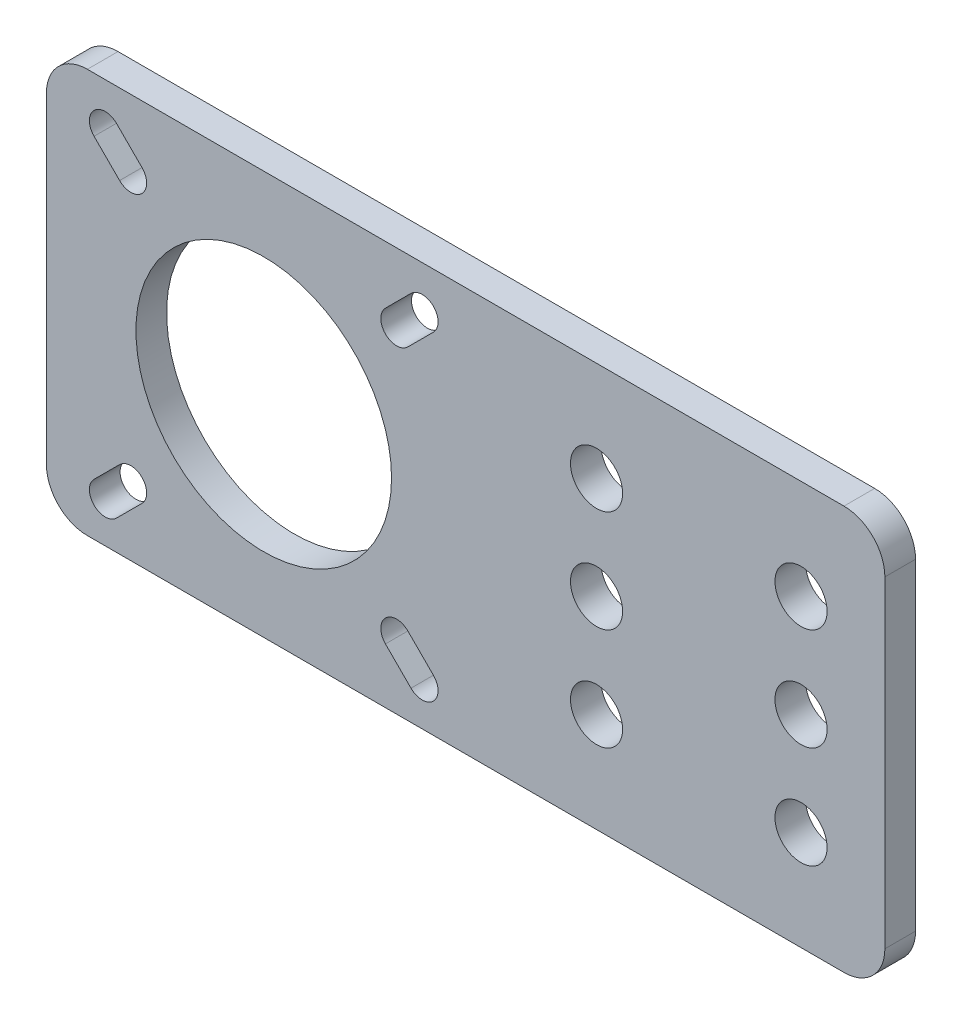
ISO-10303-21;
HEADER;
FILE_DESCRIPTION(('STEP AP214'),'2;1');
FILE_NAME('part.step','',(''),(''),'','','');
FILE_SCHEMA(('AUTOMOTIVE_DESIGN { 1 0 10303 214 1 1 1 1 }'));
ENDSEC;
DATA;
#1=APPLICATION_CONTEXT('core data for automotive mechanical design processes');
#2=APPLICATION_PROTOCOL_DEFINITION('international standard','automotive_design',2000,#1);
#3=PRODUCT_CONTEXT('',#1,'mechanical');
#4=PRODUCT('Part','Part','',(#3));
#5=PRODUCT_RELATED_PRODUCT_CATEGORY('part','',(#4));
#6=PRODUCT_DEFINITION_FORMATION('','',#4);
#7=PRODUCT_DEFINITION_CONTEXT('part definition',#1,'design');
#8=PRODUCT_DEFINITION('design','',#6,#7);
#9=PRODUCT_DEFINITION_SHAPE('','',#8);
#10=(LENGTH_UNIT() NAMED_UNIT(*) SI_UNIT(.MILLI.,.METRE.));
#11=(NAMED_UNIT(*) PLANE_ANGLE_UNIT() SI_UNIT($,.RADIAN.));
#12=(NAMED_UNIT(*) SI_UNIT($,.STERADIAN.) SOLID_ANGLE_UNIT());
#13=UNCERTAINTY_MEASURE_WITH_UNIT(LENGTH_MEASURE(1.E-05),#10,'distance_accuracy_value','');
#14=(GEOMETRIC_REPRESENTATION_CONTEXT(3) GLOBAL_UNCERTAINTY_ASSIGNED_CONTEXT((#13)) GLOBAL_UNIT_ASSIGNED_CONTEXT((#10,
#11,#12)) REPRESENTATION_CONTEXT('',''));
#15=CARTESIAN_POINT('',(0.,0.,0.));
#16=DIRECTION('',(0.,0.,1.));
#17=DIRECTION('',(1.,0.,0.));
#18=AXIS2_PLACEMENT_3D('',#15,#16,#17);
#19=CARTESIAN_POINT('',(37.9262866139666,47.8327926657264,3.));
#20=DIRECTION('',(0.,0.,1.));
#21=DIRECTION('',(1.,0.,0.));
#22=AXIS2_PLACEMENT_3D('',#19,#20,#21);
#23=PLANE('',#22);
#24=CARTESIAN_POINT('',(13.7262866139666,42.0827926657264,3.));
#25=DIRECTION('',(0.,0.,1.));
#26=DIRECTION('',(1.,0.,0.));
#27=AXIS2_PLACEMENT_3D('',#24,#25,#26);
#28=CIRCLE('',#27,2.54999999999999);
#29=CARTESIAN_POINT('',(16.2762866139666,42.0827926657264,3.));
#30=VERTEX_POINT('',#29);
#31=EDGE_CURVE('E328',#30,#30,#28,.T.);
#32=ORIENTED_EDGE('',*,*,#31,.F.);
#33=EDGE_LOOP('',(#32));
#34=FACE_BOUND('',#33,.T.);
#35=CARTESIAN_POINT('',(33.7262866139666,32.0827926657264,3.));
#36=DIRECTION('',(0.,0.,1.));
#37=DIRECTION('',(1.,0.,0.));
#38=AXIS2_PLACEMENT_3D('',#35,#36,#37);
#39=CIRCLE('',#38,2.54999999999999);
#40=CARTESIAN_POINT('',(36.2762866139666,32.0827926657264,3.));
#41=VERTEX_POINT('',#40);
#42=EDGE_CURVE('E340',#41,#41,#39,.T.);
#43=ORIENTED_EDGE('',*,*,#42,.F.);
#44=EDGE_LOOP('',(#43));
#45=FACE_BOUND('',#44,.T.);
#46=CARTESIAN_POINT('',(33.7262866139666,22.0827926657264,3.));
#47=DIRECTION('',(0.,0.,1.));
#48=DIRECTION('',(1.,0.,0.));
#49=AXIS2_PLACEMENT_3D('',#46,#47,#48);
#50=CIRCLE('',#49,2.54999999999999);
#51=CARTESIAN_POINT('',(36.2762866139666,22.0827926657264,3.));
#52=VERTEX_POINT('',#51);
#53=EDGE_CURVE('E352',#52,#52,#50,.T.);
#54=ORIENTED_EDGE('',*,*,#53,.F.);
#55=EDGE_LOOP('',(#54));
#56=FACE_BOUND('',#55,.T.);
#57=CARTESIAN_POINT('',(37.9262866139666,47.8327926657264,3.));
#58=DIRECTION('',(0.,0.,1.));
#59=DIRECTION('',(1.,0.,0.));
#60=AXIS2_PLACEMENT_3D('',#57,#58,#59);
#61=CIRCLE('',#60,4.);
#62=CARTESIAN_POINT('',(41.9262866139666,47.8327926657264,3.));
#63=VERTEX_POINT('',#62);
#64=CARTESIAN_POINT('',(37.9262866139666,51.8327926657264,3.));
#65=VERTEX_POINT('',#64);
#66=EDGE_CURVE('E364',#63,#65,#61,.T.);
#67=ORIENTED_EDGE('',*,*,#66,.T.);
#68=DIRECTION('',(-1.,0.,0.));
#69=VECTOR('',#68,1.);
#70=CARTESIAN_POINT('',(-36.0737133860334,51.8327926657264,3.));
#71=LINE('',#70,#69);
#72=CARTESIAN_POINT('',(-36.0737133860334,51.8327926657264,3.));
#73=VERTEX_POINT('',#72);
#74=EDGE_CURVE('E367',#65,#73,#71,.T.);
#75=ORIENTED_EDGE('',*,*,#74,.T.);
#76=CARTESIAN_POINT('',(-36.0737133860334,47.8327926657264,3.));
#77=DIRECTION('',(0.,0.,1.));
#78=DIRECTION('',(-1.,0.,0.));
#79=AXIS2_PLACEMENT_3D('',#76,#77,#78);
#80=CIRCLE('',#79,4.);
#81=CARTESIAN_POINT('',(-40.0737133860334,47.8327926657264,3.));
#82=VERTEX_POINT('',#81);
#83=EDGE_CURVE('E370',#73,#82,#80,.T.);
#84=ORIENTED_EDGE('',*,*,#83,.T.);
#85=DIRECTION('',(0.,-1.,0.));
#86=VECTOR('',#85,1.);
#87=CARTESIAN_POINT('',(-40.0737133860334,47.8327926657264,3.));
#88=LINE('',#87,#86);
#89=CARTESIAN_POINT('',(-40.0737133860334,16.3327926657264,3.));
#90=VERTEX_POINT('',#89);
#91=EDGE_CURVE('E372',#82,#90,#88,.T.);
#92=ORIENTED_EDGE('',*,*,#91,.T.);
#93=CARTESIAN_POINT('',(-36.0737133860334,16.3327926657264,3.));
#94=DIRECTION('',(0.,0.,1.));
#95=DIRECTION('',(1.,0.,0.));
#96=AXIS2_PLACEMENT_3D('',#93,#94,#95);
#97=CIRCLE('',#96,4.);
#98=CARTESIAN_POINT('',(-36.0737133860334,12.3327926657264,3.));
#99=VERTEX_POINT('',#98);
#100=EDGE_CURVE('E374',#90,#99,#97,.T.);
#101=ORIENTED_EDGE('',*,*,#100,.T.);
#102=DIRECTION('',(1.,0.,0.));
#103=VECTOR('',#102,1.);
#104=CARTESIAN_POINT('',(-36.0737133860334,12.3327926657264,3.));
#105=LINE('',#104,#103);
#106=CARTESIAN_POINT('',(37.9262866139666,12.3327926657264,3.));
#107=VERTEX_POINT('',#106);
#108=EDGE_CURVE('E376',#99,#107,#105,.T.);
#109=ORIENTED_EDGE('',*,*,#108,.T.);
#110=CARTESIAN_POINT('',(37.9262866139666,16.3327926657264,3.));
#111=DIRECTION('',(0.,0.,1.));
#112=DIRECTION('',(1.,0.,0.));
#113=AXIS2_PLACEMENT_3D('',#110,#111,#112);
#114=CIRCLE('',#113,4.);
#115=CARTESIAN_POINT('',(41.9262866139666,16.3327926657264,3.));
#116=VERTEX_POINT('',#115);
#117=EDGE_CURVE('E378',#107,#116,#114,.T.);
#118=ORIENTED_EDGE('',*,*,#117,.T.);
#119=DIRECTION('',(0.,1.,0.));
#120=VECTOR('',#119,1.);
#121=CARTESIAN_POINT('',(41.9262866139666,47.8327926657264,3.));
#122=LINE('',#121,#120);
#123=EDGE_CURVE('E380',#116,#63,#122,.T.);
#124=ORIENTED_EDGE('',*,*,#123,.T.);
#125=EDGE_LOOP('',(#67,#75,#84,#92,#101,#109,#118,#124));
#126=FACE_BOUND('',#125,.T.);
#127=CARTESIAN_POINT('',(-18.8237133860334,32.0827926657264,3.));
#128=DIRECTION('',(0.,0.,1.));
#129=DIRECTION('',(1.,0.,0.));
#130=AXIS2_PLACEMENT_3D('',#127,#128,#129);
#131=CIRCLE('',#130,12.5);
#132=CARTESIAN_POINT('',(-6.32371338603339,32.0827926657264,3.));
#133=VERTEX_POINT('',#132);
#134=EDGE_CURVE('E358',#133,#133,#131,.T.);
#135=ORIENTED_EDGE('',*,*,#134,.F.);
#136=EDGE_LOOP('',(#135));
#137=FACE_BOUND('',#136,.T.);
#138=CARTESIAN_POINT('',(33.7262866139666,42.0827926657264,3.));
#139=DIRECTION('',(0.,0.,1.));
#140=DIRECTION('',(1.,0.,0.));
#141=AXIS2_PLACEMENT_3D('',#138,#139,#140);
#142=CIRCLE('',#141,2.54999999999999);
#143=CARTESIAN_POINT('',(36.2762866139666,42.0827926657264,3.));
#144=VERTEX_POINT('',#143);
#145=EDGE_CURVE('E346',#144,#144,#142,.T.);
#146=ORIENTED_EDGE('',*,*,#145,.F.);
#147=EDGE_LOOP('',(#146));
#148=FACE_BOUND('',#147,.T.);
#149=CARTESIAN_POINT('',(13.7262866139666,22.0827926657264,3.));
#150=DIRECTION('',(0.,0.,1.));
#151=DIRECTION('',(1.,0.,0.));
#152=AXIS2_PLACEMENT_3D('',#149,#150,#151);
#153=CIRCLE('',#152,2.54999999999999);
#154=CARTESIAN_POINT('',(16.2762866139666,22.0827926657264,3.));
#155=VERTEX_POINT('',#154);
#156=EDGE_CURVE('E334',#155,#155,#153,.T.);
#157=ORIENTED_EDGE('',*,*,#156,.F.);
#158=EDGE_LOOP('',(#157));
#159=FACE_BOUND('',#158,.T.);
#160=CARTESIAN_POINT('',(13.7262866139666,32.0827926657264,3.));
#161=DIRECTION('',(0.,0.,1.));
#162=DIRECTION('',(1.,0.,0.));
#163=AXIS2_PLACEMENT_3D('',#160,#161,#162);
#164=CIRCLE('',#163,2.54999999999999);
#165=CARTESIAN_POINT('',(16.2762866139666,32.0827926657264,3.));
#166=VERTEX_POINT('',#165);
#167=EDGE_CURVE('E322',#166,#166,#164,.T.);
#168=ORIENTED_EDGE('',*,*,#167,.F.);
#169=EDGE_LOOP('',(#168));
#170=FACE_BOUND('',#169,.T.);
#171=DIRECTION('',(0.70710678118654,0.707106781186555,0.));
#172=VECTOR('',#171,1.);
#173=CARTESIAN_POINT('',(-33.2276978751942,15.2367771548873,3.));
#174=LINE('',#173,#172);
#175=CARTESIAN_POINT('',(-33.2276978751942,15.2367771548873,3.));
#176=VERTEX_POINT('',#175);
#177=CARTESIAN_POINT('',(-30.7276978751942,17.7367771548873,3.));
#178=VERTEX_POINT('',#177);
#179=EDGE_CURVE('E293',#176,#178,#174,.T.);
#180=ORIENTED_EDGE('',*,*,#179,.F.);
#181=CARTESIAN_POINT('',(-34.3237133860334,16.3327926657264,3.));
#182=DIRECTION('',(0.,0.,1.));
#183=DIRECTION('',(1.,0.,0.));
#184=AXIS2_PLACEMENT_3D('',#181,#182,#183);
#185=CIRCLE('',#184,1.54999999999999);
#186=CARTESIAN_POINT('',(-35.4197288968725,17.4288081765655,3.));
#187=VERTEX_POINT('',#186);
#188=EDGE_CURVE('E291',#187,#176,#185,.T.);
#189=ORIENTED_EDGE('',*,*,#188,.F.);
#190=DIRECTION('',(-0.707106781186544,-0.70710678118655,0.));
#191=VECTOR('',#190,1.);
#192=CARTESIAN_POINT('',(-35.4197288968725,17.4288081765655,3.));
#193=LINE('',#192,#191);
#194=CARTESIAN_POINT('',(-32.9197288968725,19.9288081765655,3.));
#195=VERTEX_POINT('',#194);
#196=EDGE_CURVE('E299',#195,#187,#193,.T.);
#197=ORIENTED_EDGE('',*,*,#196,.F.);
#198=CARTESIAN_POINT('',(-31.8237133860334,18.8327926657264,3.));
#199=DIRECTION('',(0.,0.,1.));
#200=DIRECTION('',(1.,0.,0.));
#201=AXIS2_PLACEMENT_3D('',#198,#199,#200);
#202=CIRCLE('',#201,1.54999999999998);
#203=EDGE_CURVE('E296',#178,#195,#202,.T.);
#204=ORIENTED_EDGE('',*,*,#203,.F.);
#205=EDGE_LOOP('',(#180,#189,#197,#204));
#206=FACE_BOUND('',#205,.T.);
#207=DIRECTION('',(0.707106781186543,-0.707106781186551,0.));
#208=VECTOR('',#207,1.);
#209=CARTESIAN_POINT('',(-4.41972889687255,15.2367771548872,3.));
#210=LINE('',#209,#208);
#211=CARTESIAN_POINT('',(-6.91972889687255,17.7367771548873,3.));
#212=VERTEX_POINT('',#211);
#213=CARTESIAN_POINT('',(-4.41972889687255,15.2367771548872,3.));
#214=VERTEX_POINT('',#213);
#215=EDGE_CURVE('E262',#212,#214,#210,.T.);
#216=ORIENTED_EDGE('',*,*,#215,.F.);
#217=CARTESIAN_POINT('',(-5.82371338603339,18.8327926657264,3.));
#218=DIRECTION('',(0.,0.,1.));
#219=DIRECTION('',(-1.,0.,0.));
#220=AXIS2_PLACEMENT_3D('',#217,#218,#219);
#221=CIRCLE('',#220,1.55);
#222=CARTESIAN_POINT('',(-4.72769787519425,19.9288081765656,3.));
#223=VERTEX_POINT('',#222);
#224=EDGE_CURVE('E260',#223,#212,#221,.T.);
#225=ORIENTED_EDGE('',*,*,#224,.F.);
#226=DIRECTION('',(-0.707106781186544,0.70710678118655,0.));
#227=VECTOR('',#226,1.);
#228=CARTESIAN_POINT('',(-2.22769787519424,17.4288081765655,3.));
#229=LINE('',#228,#227);
#230=CARTESIAN_POINT('',(-2.22769787519424,17.4288081765655,3.));
#231=VERTEX_POINT('',#230);
#232=EDGE_CURVE('E268',#231,#223,#229,.T.);
#233=ORIENTED_EDGE('',*,*,#232,.F.);
#234=CARTESIAN_POINT('',(-3.32371338603339,16.3327926657264,3.));
#235=DIRECTION('',(0.,0.,1.));
#236=DIRECTION('',(-1.,0.,0.));
#237=AXIS2_PLACEMENT_3D('',#234,#235,#236);
#238=CIRCLE('',#237,1.55);
#239=EDGE_CURVE('E265',#214,#231,#238,.T.);
#240=ORIENTED_EDGE('',*,*,#239,.F.);
#241=EDGE_LOOP('',(#216,#225,#233,#240));
#242=FACE_BOUND('',#241,.T.);
#243=DIRECTION('',(-0.707106781186547,-0.707106781186547,0.));
#244=VECTOR('',#243,1.);
#245=CARTESIAN_POINT('',(-4.41972889687253,48.6788081765655,3.));
#246=LINE('',#245,#244);
#247=CARTESIAN_POINT('',(-4.41972889687253,48.6788081765655,3.));
#248=VERTEX_POINT('',#247);
#249=CARTESIAN_POINT('',(-6.91972889687255,46.1788081765655,3.));
#250=VERTEX_POINT('',#249);
#251=EDGE_CURVE('E231',#248,#250,#246,.T.);
#252=ORIENTED_EDGE('',*,*,#251,.F.);
#253=CARTESIAN_POINT('',(-3.32371338603339,47.5827926657264,3.));
#254=DIRECTION('',(0.,0.,1.));
#255=DIRECTION('',(1.,0.,0.));
#256=AXIS2_PLACEMENT_3D('',#253,#254,#255);
#257=CIRCLE('',#256,1.55);
#258=CARTESIAN_POINT('',(-2.22769787519424,46.4867771548872,3.));
#259=VERTEX_POINT('',#258);
#260=EDGE_CURVE('E229',#259,#248,#257,.T.);
#261=ORIENTED_EDGE('',*,*,#260,.F.);
#262=DIRECTION('',(0.707106781186549,0.707106781186546,0.));
#263=VECTOR('',#262,1.);
#264=CARTESIAN_POINT('',(-2.22769787519424,46.4867771548872,3.));
#265=LINE('',#264,#263);
#266=CARTESIAN_POINT('',(-4.72769787519424,43.9867771548872,3.));
#267=VERTEX_POINT('',#266);
#268=EDGE_CURVE('E237',#267,#259,#265,.T.);
#269=ORIENTED_EDGE('',*,*,#268,.F.);
#270=CARTESIAN_POINT('',(-5.82371338603339,45.0827926657264,3.));
#271=DIRECTION('',(0.,0.,1.));
#272=DIRECTION('',(1.,0.,0.));
#273=AXIS2_PLACEMENT_3D('',#270,#271,#272);
#274=CIRCLE('',#273,1.55);
#275=EDGE_CURVE('E234',#250,#267,#274,.T.);
#276=ORIENTED_EDGE('',*,*,#275,.F.);
#277=EDGE_LOOP('',(#252,#261,#269,#276));
#278=FACE_BOUND('',#277,.T.);
#279=DIRECTION('',(-0.707106781186551,0.707106781186544,0.));
#280=VECTOR('',#279,1.);
#281=CARTESIAN_POINT('',(-33.2276978751942,48.6788081765655,3.));
#282=LINE('',#281,#280);
#283=CARTESIAN_POINT('',(-30.7276978751942,46.1788081765655,3.));
#284=VERTEX_POINT('',#283);
#285=CARTESIAN_POINT('',(-33.2276978751942,48.6788081765655,3.));
#286=VERTEX_POINT('',#285);
#287=EDGE_CURVE('E201',#284,#286,#282,.T.);
#288=ORIENTED_EDGE('',*,*,#287,.F.);
#289=CARTESIAN_POINT('',(-31.8237133860334,45.0827926657264,3.));
#290=DIRECTION('',(0.,0.,1.));
#291=DIRECTION('',(-1.,0.,0.));
#292=AXIS2_PLACEMENT_3D('',#289,#290,#291);
#293=CIRCLE('',#292,1.55000000000001);
#294=CARTESIAN_POINT('',(-32.9197288968725,43.9867771548872,3.));
#295=VERTEX_POINT('',#294);
#296=EDGE_CURVE('E193',#295,#284,#293,.T.);
#297=ORIENTED_EDGE('',*,*,#296,.F.);
#298=DIRECTION('',(0.707106781186545,-0.707106781186549,0.));
#299=VECTOR('',#298,1.);
#300=CARTESIAN_POINT('',(-35.4197288968725,46.4867771548872,3.));
#301=LINE('',#300,#299);
#302=CARTESIAN_POINT('',(-35.4197288968725,46.4867771548872,3.));
#303=VERTEX_POINT('',#302);
#304=EDGE_CURVE('E215',#303,#295,#301,.T.);
#305=ORIENTED_EDGE('',*,*,#304,.F.);
#306=CARTESIAN_POINT('',(-34.3237133860334,47.5827926657264,3.));
#307=DIRECTION('',(0.,0.,1.));
#308=DIRECTION('',(-1.,0.,0.));
#309=AXIS2_PLACEMENT_3D('',#306,#307,#308);
#310=CIRCLE('',#309,1.55);
#311=EDGE_CURVE('E213',#286,#303,#310,.T.);
#312=ORIENTED_EDGE('',*,*,#311,.F.);
#313=EDGE_LOOP('',(#288,#297,#305,#312));
#314=FACE_BOUND('',#313,.T.);
#315=ADVANCED_FACE('F32',(#34,#45,#56,#126,#137,#148,#159,#170,#206,#242,#278,#314),#23,.T.);
#316=CARTESIAN_POINT('',(37.9262866139666,47.8327926657264,0.));
#317=DIRECTION('',(0.,0.,1.));
#318=DIRECTION('',(1.,0.,0.));
#319=AXIS2_PLACEMENT_3D('',#316,#317,#318);
#320=PLANE('',#319);
#321=CARTESIAN_POINT('',(-3.32371338603339,47.5827926657264,0.));
#322=DIRECTION('',(0.,0.,1.));
#323=DIRECTION('',(1.,0.,0.));
#324=AXIS2_PLACEMENT_3D('',#321,#322,#323);
#325=CIRCLE('',#324,1.55);
#326=CARTESIAN_POINT('',(-2.22769787519424,46.4867771548872,0.));
#327=VERTEX_POINT('',#326);
#328=CARTESIAN_POINT('',(-4.41972889687253,48.6788081765655,0.));
#329=VERTEX_POINT('',#328);
#330=EDGE_CURVE('E209',#327,#329,#325,.T.);
#331=ORIENTED_EDGE('',*,*,#330,.T.);
#332=DIRECTION('',(-0.707106781186547,-0.707106781186547,0.));
#333=VECTOR('',#332,1.);
#334=CARTESIAN_POINT('',(-4.41972889687253,48.6788081765655,0.));
#335=LINE('',#334,#333);
#336=CARTESIAN_POINT('',(-6.91972889687255,46.1788081765655,0.));
#337=VERTEX_POINT('',#336);
#338=EDGE_CURVE('E242',#329,#337,#335,.T.);
#339=ORIENTED_EDGE('',*,*,#338,.T.);
#340=CARTESIAN_POINT('',(-5.82371338603339,45.0827926657264,0.));
#341=DIRECTION('',(0.,0.,1.));
#342=DIRECTION('',(1.,0.,0.));
#343=AXIS2_PLACEMENT_3D('',#340,#341,#342);
#344=CIRCLE('',#343,1.55);
#345=CARTESIAN_POINT('',(-4.72769787519425,43.9867771548872,0.));
#346=VERTEX_POINT('',#345);
#347=EDGE_CURVE('E245',#337,#346,#344,.T.);
#348=ORIENTED_EDGE('',*,*,#347,.T.);
#349=DIRECTION('',(0.707106781186549,0.707106781186546,0.));
#350=VECTOR('',#349,1.);
#351=CARTESIAN_POINT('',(-2.22769787519424,46.4867771548872,0.));
#352=LINE('',#351,#350);
#353=EDGE_CURVE('E232',#346,#327,#352,.T.);
#354=ORIENTED_EDGE('',*,*,#353,.T.);
#355=EDGE_LOOP('',(#331,#339,#348,#354));
#356=FACE_BOUND('',#355,.T.);
#357=CARTESIAN_POINT('',(-34.3237133860334,16.3327926657264,0.));
#358=DIRECTION('',(0.,0.,1.));
#359=DIRECTION('',(1.,0.,0.));
#360=AXIS2_PLACEMENT_3D('',#357,#358,#359);
#361=CIRCLE('',#360,1.54999999999999);
#362=CARTESIAN_POINT('',(-35.4197288968725,17.4288081765655,0.));
#363=VERTEX_POINT('',#362);
#364=CARTESIAN_POINT('',(-33.2276978751942,15.2367771548873,0.));
#365=VERTEX_POINT('',#364);
#366=EDGE_CURVE('E290',#363,#365,#361,.T.);
#367=ORIENTED_EDGE('',*,*,#366,.T.);
#368=DIRECTION('',(0.70710678118654,0.707106781186555,0.));
#369=VECTOR('',#368,1.);
#370=CARTESIAN_POINT('',(-33.2276978751942,15.2367771548873,0.));
#371=LINE('',#370,#369);
#372=CARTESIAN_POINT('',(-30.7276978751942,17.7367771548873,0.));
#373=VERTEX_POINT('',#372);
#374=EDGE_CURVE('E304',#365,#373,#371,.T.);
#375=ORIENTED_EDGE('',*,*,#374,.T.);
#376=CARTESIAN_POINT('',(-31.8237133860334,18.8327926657264,0.));
#377=DIRECTION('',(0.,0.,1.));
#378=DIRECTION('',(1.,0.,0.));
#379=AXIS2_PLACEMENT_3D('',#376,#377,#378);
#380=CIRCLE('',#379,1.54999999999998);
#381=CARTESIAN_POINT('',(-32.9197288968725,19.9288081765656,0.));
#382=VERTEX_POINT('',#381);
#383=EDGE_CURVE('E307',#373,#382,#380,.T.);
#384=ORIENTED_EDGE('',*,*,#383,.T.);
#385=DIRECTION('',(-0.707106781186544,-0.70710678118655,0.));
#386=VECTOR('',#385,1.);
#387=CARTESIAN_POINT('',(-35.4197288968725,17.4288081765655,0.));
#388=LINE('',#387,#386);
#389=EDGE_CURVE('E294',#382,#363,#388,.T.);
#390=ORIENTED_EDGE('',*,*,#389,.T.);
#391=EDGE_LOOP('',(#367,#375,#384,#390));
#392=FACE_BOUND('',#391,.T.);
#393=CARTESIAN_POINT('',(37.9262866139666,47.8327926657264,0.));
#394=DIRECTION('',(0.,0.,1.));
#395=DIRECTION('',(1.,0.,0.));
#396=AXIS2_PLACEMENT_3D('',#393,#394,#395);
#397=CIRCLE('',#396,4.);
#398=CARTESIAN_POINT('',(41.9262866139666,47.8327926657264,0.));
#399=VERTEX_POINT('',#398);
#400=CARTESIAN_POINT('',(37.9262866139666,51.8327926657264,0.));
#401=VERTEX_POINT('',#400);
#402=EDGE_CURVE('E361',#399,#401,#397,.T.);
#403=ORIENTED_EDGE('',*,*,#402,.F.);
#404=DIRECTION('',(0.,1.,0.));
#405=VECTOR('',#404,1.);
#406=CARTESIAN_POINT('',(41.9262866139666,47.8327926657264,0.));
#407=LINE('',#406,#405);
#408=CARTESIAN_POINT('',(41.9262866139666,16.3327926657264,0.));
#409=VERTEX_POINT('',#408);
#410=EDGE_CURVE('E368',#409,#399,#407,.T.);
#411=ORIENTED_EDGE('',*,*,#410,.F.);
#412=CARTESIAN_POINT('',(37.9262866139666,16.3327926657264,0.));
#413=DIRECTION('',(0.,0.,1.));
#414=DIRECTION('',(1.,0.,0.));
#415=AXIS2_PLACEMENT_3D('',#412,#413,#414);
#416=CIRCLE('',#415,4.);
#417=CARTESIAN_POINT('',(37.9262866139666,12.3327926657264,0.));
#418=VERTEX_POINT('',#417);
#419=EDGE_CURVE('E395',#418,#409,#416,.T.);
#420=ORIENTED_EDGE('',*,*,#419,.F.);
#421=DIRECTION('',(1.,0.,0.));
#422=VECTOR('',#421,1.);
#423=CARTESIAN_POINT('',(-36.0737133860334,12.3327926657264,0.));
#424=LINE('',#423,#422);
#425=CARTESIAN_POINT('',(-36.0737133860334,12.3327926657264,0.));
#426=VERTEX_POINT('',#425);
#427=EDGE_CURVE('E393',#426,#418,#424,.T.);
#428=ORIENTED_EDGE('',*,*,#427,.F.);
#429=CARTESIAN_POINT('',(-36.0737133860334,16.3327926657264,0.));
#430=DIRECTION('',(0.,0.,1.));
#431=DIRECTION('',(1.,0.,0.));
#432=AXIS2_PLACEMENT_3D('',#429,#430,#431);
#433=CIRCLE('',#432,4.);
#434=CARTESIAN_POINT('',(-40.0737133860334,16.3327926657264,0.));
#435=VERTEX_POINT('',#434);
#436=EDGE_CURVE('E391',#435,#426,#433,.T.);
#437=ORIENTED_EDGE('',*,*,#436,.F.);
#438=DIRECTION('',(0.,-1.,0.));
#439=VECTOR('',#438,1.);
#440=CARTESIAN_POINT('',(-40.0737133860334,47.8327926657264,0.));
#441=LINE('',#440,#439);
#442=CARTESIAN_POINT('',(-40.0737133860334,47.8327926657264,0.));
#443=VERTEX_POINT('',#442);
#444=EDGE_CURVE('E389',#443,#435,#441,.T.);
#445=ORIENTED_EDGE('',*,*,#444,.F.);
#446=CARTESIAN_POINT('',(-36.0737133860334,47.8327926657264,0.));
#447=DIRECTION('',(0.,0.,1.));
#448=DIRECTION('',(-1.,0.,0.));
#449=AXIS2_PLACEMENT_3D('',#446,#447,#448);
#450=CIRCLE('',#449,4.);
#451=CARTESIAN_POINT('',(-36.0737133860334,51.8327926657264,0.));
#452=VERTEX_POINT('',#451);
#453=EDGE_CURVE('E387',#452,#443,#450,.T.);
#454=ORIENTED_EDGE('',*,*,#453,.F.);
#455=DIRECTION('',(-1.,0.,0.));
#456=VECTOR('',#455,1.);
#457=CARTESIAN_POINT('',(-36.0737133860334,51.8327926657264,0.));
#458=LINE('',#457,#456);
#459=EDGE_CURVE('E385',#401,#452,#458,.T.);
#460=ORIENTED_EDGE('',*,*,#459,.F.);
#461=EDGE_LOOP('',(#403,#411,#420,#428,#437,#445,#454,#460));
#462=FACE_BOUND('',#461,.T.);
#463=CARTESIAN_POINT('',(-18.8237133860334,32.0827926657264,0.));
#464=DIRECTION('',(0.,0.,1.));
#465=DIRECTION('',(1.,0.,0.));
#466=AXIS2_PLACEMENT_3D('',#463,#464,#465);
#467=CIRCLE('',#466,12.5);
#468=CARTESIAN_POINT('',(-6.32371338603339,32.0827926657264,0.));
#469=VERTEX_POINT('',#468);
#470=EDGE_CURVE('E355',#469,#469,#467,.T.);
#471=ORIENTED_EDGE('',*,*,#470,.T.);
#472=EDGE_LOOP('',(#471));
#473=FACE_BOUND('',#472,.T.);
#474=CARTESIAN_POINT('',(33.7262866139666,22.0827926657264,0.));
#475=DIRECTION('',(0.,0.,1.));
#476=DIRECTION('',(1.,0.,0.));
#477=AXIS2_PLACEMENT_3D('',#474,#475,#476);
#478=CIRCLE('',#477,2.54999999999999);
#479=CARTESIAN_POINT('',(36.2762866139666,22.0827926657264,0.));
#480=VERTEX_POINT('',#479);
#481=EDGE_CURVE('E349',#480,#480,#478,.T.);
#482=ORIENTED_EDGE('',*,*,#481,.T.);
#483=EDGE_LOOP('',(#482));
#484=FACE_BOUND('',#483,.T.);
#485=CARTESIAN_POINT('',(33.7262866139666,42.0827926657264,0.));
#486=DIRECTION('',(0.,0.,1.));
#487=DIRECTION('',(1.,0.,0.));
#488=AXIS2_PLACEMENT_3D('',#485,#486,#487);
#489=CIRCLE('',#488,2.54999999999999);
#490=CARTESIAN_POINT('',(36.2762866139666,42.0827926657264,0.));
#491=VERTEX_POINT('',#490);
#492=EDGE_CURVE('E343',#491,#491,#489,.T.);
#493=ORIENTED_EDGE('',*,*,#492,.T.);
#494=EDGE_LOOP('',(#493));
#495=FACE_BOUND('',#494,.T.);
#496=CARTESIAN_POINT('',(33.7262866139666,32.0827926657264,0.));
#497=DIRECTION('',(0.,0.,1.));
#498=DIRECTION('',(1.,0.,0.));
#499=AXIS2_PLACEMENT_3D('',#496,#497,#498);
#500=CIRCLE('',#499,2.54999999999999);
#501=CARTESIAN_POINT('',(36.2762866139666,32.0827926657264,0.));
#502=VERTEX_POINT('',#501);
#503=EDGE_CURVE('E337',#502,#502,#500,.T.);
#504=ORIENTED_EDGE('',*,*,#503,.T.);
#505=EDGE_LOOP('',(#504));
#506=FACE_BOUND('',#505,.T.);
#507=CARTESIAN_POINT('',(13.7262866139666,22.0827926657264,0.));
#508=DIRECTION('',(0.,0.,1.));
#509=DIRECTION('',(1.,0.,0.));
#510=AXIS2_PLACEMENT_3D('',#507,#508,#509);
#511=CIRCLE('',#510,2.54999999999999);
#512=CARTESIAN_POINT('',(16.2762866139666,22.0827926657264,0.));
#513=VERTEX_POINT('',#512);
#514=EDGE_CURVE('E331',#513,#513,#511,.T.);
#515=ORIENTED_EDGE('',*,*,#514,.T.);
#516=EDGE_LOOP('',(#515));
#517=FACE_BOUND('',#516,.T.);
#518=CARTESIAN_POINT('',(13.7262866139666,42.0827926657264,0.));
#519=DIRECTION('',(0.,0.,1.));
#520=DIRECTION('',(1.,0.,0.));
#521=AXIS2_PLACEMENT_3D('',#518,#519,#520);
#522=CIRCLE('',#521,2.54999999999999);
#523=CARTESIAN_POINT('',(16.2762866139666,42.0827926657264,0.));
#524=VERTEX_POINT('',#523);
#525=EDGE_CURVE('E325',#524,#524,#522,.T.);
#526=ORIENTED_EDGE('',*,*,#525,.T.);
#527=EDGE_LOOP('',(#526));
#528=FACE_BOUND('',#527,.T.);
#529=CARTESIAN_POINT('',(13.7262866139666,32.0827926657264,0.));
#530=DIRECTION('',(0.,0.,1.));
#531=DIRECTION('',(1.,0.,0.));
#532=AXIS2_PLACEMENT_3D('',#529,#530,#531);
#533=CIRCLE('',#532,2.54999999999999);
#534=CARTESIAN_POINT('',(16.2762866139666,32.0827926657264,0.));
#535=VERTEX_POINT('',#534);
#536=EDGE_CURVE('E321',#535,#535,#533,.T.);
#537=ORIENTED_EDGE('',*,*,#536,.T.);
#538=EDGE_LOOP('',(#537));
#539=FACE_BOUND('',#538,.T.);
#540=CARTESIAN_POINT('',(-5.82371338603339,18.8327926657264,0.));
#541=DIRECTION('',(0.,0.,1.));
#542=DIRECTION('',(-1.,0.,0.));
#543=AXIS2_PLACEMENT_3D('',#540,#541,#542);
#544=CIRCLE('',#543,1.55);
#545=CARTESIAN_POINT('',(-4.72769787519425,19.9288081765656,0.));
#546=VERTEX_POINT('',#545);
#547=CARTESIAN_POINT('',(-6.91972889687255,17.7367771548873,0.));
#548=VERTEX_POINT('',#547);
#549=EDGE_CURVE('E259',#546,#548,#544,.T.);
#550=ORIENTED_EDGE('',*,*,#549,.T.);
#551=DIRECTION('',(0.707106781186543,-0.707106781186551,0.));
#552=VECTOR('',#551,1.);
#553=CARTESIAN_POINT('',(-4.41972889687255,15.2367771548872,0.));
#554=LINE('',#553,#552);
#555=CARTESIAN_POINT('',(-4.41972889687255,15.2367771548872,0.));
#556=VERTEX_POINT('',#555);
#557=EDGE_CURVE('E273',#548,#556,#554,.T.);
#558=ORIENTED_EDGE('',*,*,#557,.T.);
#559=CARTESIAN_POINT('',(-3.32371338603339,16.3327926657264,0.));
#560=DIRECTION('',(0.,0.,1.));
#561=DIRECTION('',(-1.,0.,0.));
#562=AXIS2_PLACEMENT_3D('',#559,#560,#561);
#563=CIRCLE('',#562,1.55);
#564=CARTESIAN_POINT('',(-2.22769787519424,17.4288081765655,0.));
#565=VERTEX_POINT('',#564);
#566=EDGE_CURVE('E276',#556,#565,#563,.T.);
#567=ORIENTED_EDGE('',*,*,#566,.T.);
#568=DIRECTION('',(-0.707106781186544,0.70710678118655,0.));
#569=VECTOR('',#568,1.);
#570=CARTESIAN_POINT('',(-2.22769787519424,17.4288081765655,0.));
#571=LINE('',#570,#569);
#572=EDGE_CURVE('E263',#565,#546,#571,.T.);
#573=ORIENTED_EDGE('',*,*,#572,.T.);
#574=EDGE_LOOP('',(#550,#558,#567,#573));
#575=FACE_BOUND('',#574,.T.);
#576=CARTESIAN_POINT('',(-31.8237133860334,45.0827926657264,0.));
#577=DIRECTION('',(0.,0.,1.));
#578=DIRECTION('',(-1.,0.,0.));
#579=AXIS2_PLACEMENT_3D('',#576,#577,#578);
#580=CIRCLE('',#579,1.55000000000001);
#581=CARTESIAN_POINT('',(-32.9197288968725,43.9867771548872,0.));
#582=VERTEX_POINT('',#581);
#583=CARTESIAN_POINT('',(-30.7276978751942,46.1788081765655,0.));
#584=VERTEX_POINT('',#583);
#585=EDGE_CURVE('E55',#582,#584,#580,.T.);
#586=ORIENTED_EDGE('',*,*,#585,.T.);
#587=DIRECTION('',(-0.707106781186551,0.707106781186544,0.));
#588=VECTOR('',#587,1.);
#589=CARTESIAN_POINT('',(-33.2276978751942,48.6788081765655,0.));
#590=LINE('',#589,#588);
#591=CARTESIAN_POINT('',(-33.2276978751942,48.6788081765655,0.));
#592=VERTEX_POINT('',#591);
#593=EDGE_CURVE('E208',#584,#592,#590,.T.);
#594=ORIENTED_EDGE('',*,*,#593,.T.);
#595=CARTESIAN_POINT('',(-34.3237133860334,47.5827926657264,0.));
#596=DIRECTION('',(0.,0.,1.));
#597=DIRECTION('',(-1.,0.,0.));
#598=AXIS2_PLACEMENT_3D('',#595,#596,#597);
#599=CIRCLE('',#598,1.55);
#600=CARTESIAN_POINT('',(-35.4197288968725,46.4867771548872,0.));
#601=VERTEX_POINT('',#600);
#602=EDGE_CURVE('E221',#592,#601,#599,.T.);
#603=ORIENTED_EDGE('',*,*,#602,.T.);
#604=DIRECTION('',(0.707106781186545,-0.707106781186549,0.));
#605=VECTOR('',#604,1.);
#606=CARTESIAN_POINT('',(-35.4197288968725,46.4867771548872,0.));
#607=LINE('',#606,#605);
#608=EDGE_CURVE('E202',#601,#582,#607,.T.);
#609=ORIENTED_EDGE('',*,*,#608,.T.);
#610=EDGE_LOOP('',(#586,#594,#603,#609));
#611=FACE_BOUND('',#610,.T.);
#612=ADVANCED_FACE('F425',(#356,#392,#462,#473,#484,#495,#506,#517,#528,#539,#575,#611),#320,.F.);
#613=CARTESIAN_POINT('',(37.9262866139666,47.8327926657264,3.));
#614=DIRECTION('',(0.,0.,-1.));
#615=DIRECTION('',(-1.,0.,0.));
#616=AXIS2_PLACEMENT_3D('',#613,#614,#615);
#617=CYLINDRICAL_SURFACE('',#616,4.);
#618=ORIENTED_EDGE('',*,*,#402,.T.);
#619=DIRECTION('',(0.,0.,-1.));
#620=VECTOR('',#619,1.);
#621=CARTESIAN_POINT('',(37.9262866139666,51.8327926657264,3.));
#622=LINE('',#621,#620);
#623=EDGE_CURVE('E11',#65,#401,#622,.T.);
#624=ORIENTED_EDGE('',*,*,#623,.F.);
#625=ORIENTED_EDGE('',*,*,#66,.F.);
#626=DIRECTION('',(0.,0.,-1.));
#627=VECTOR('',#626,1.);
#628=CARTESIAN_POINT('',(41.9262866139666,47.8327926657264,3.));
#629=LINE('',#628,#627);
#630=EDGE_CURVE('E382',#63,#399,#629,.T.);
#631=ORIENTED_EDGE('',*,*,#630,.T.);
#632=EDGE_LOOP('',(#618,#624,#625,#631));
#633=FACE_BOUND('',#632,.T.);
#634=ADVANCED_FACE('F34',(#633),#617,.T.);
#635=CARTESIAN_POINT('',(-36.0737133860334,51.8327926657264,3.));
#636=DIRECTION('',(0.,-1.,0.));
#637=DIRECTION('',(0.,0.,-1.));
#638=AXIS2_PLACEMENT_3D('',#635,#636,#637);
#639=PLANE('',#638);
#640=ORIENTED_EDGE('',*,*,#459,.T.);
#641=DIRECTION('',(0.,0.,-1.));
#642=VECTOR('',#641,1.);
#643=CARTESIAN_POINT('',(-36.0737133860334,51.8327926657264,3.));
#644=LINE('',#643,#642);
#645=EDGE_CURVE('E40',#73,#452,#644,.T.);
#646=ORIENTED_EDGE('',*,*,#645,.F.);
#647=ORIENTED_EDGE('',*,*,#74,.F.);
#648=ORIENTED_EDGE('',*,*,#623,.T.);
#649=EDGE_LOOP('',(#640,#646,#647,#648));
#650=FACE_BOUND('',#649,.T.);
#651=ADVANCED_FACE('F443',(#650),#639,.F.);
#652=CARTESIAN_POINT('',(-36.0737133860334,47.8327926657264,3.));
#653=DIRECTION('',(0.,0.,-1.));
#654=DIRECTION('',(-1.,0.,0.));
#655=AXIS2_PLACEMENT_3D('',#652,#653,#654);
#656=CYLINDRICAL_SURFACE('',#655,4.);
#657=ORIENTED_EDGE('',*,*,#453,.T.);
#658=DIRECTION('',(0.,0.,-1.));
#659=VECTOR('',#658,1.);
#660=CARTESIAN_POINT('',(-40.0737133860334,47.8327926657264,3.));
#661=LINE('',#660,#659);
#662=EDGE_CURVE('E412',#82,#443,#661,.T.);
#663=ORIENTED_EDGE('',*,*,#662,.F.);
#664=ORIENTED_EDGE('',*,*,#83,.F.);
#665=ORIENTED_EDGE('',*,*,#645,.T.);
#666=EDGE_LOOP('',(#657,#663,#664,#665));
#667=FACE_BOUND('',#666,.T.);
#668=ADVANCED_FACE('F419',(#667),#656,.T.);
#669=CARTESIAN_POINT('',(-40.0737133860334,47.8327926657264,3.));
#670=DIRECTION('',(1.,0.,0.));
#671=DIRECTION('',(0.,1.,0.));
#672=AXIS2_PLACEMENT_3D('',#669,#670,#671);
#673=PLANE('',#672);
#674=ORIENTED_EDGE('',*,*,#444,.T.);
#675=DIRECTION('',(0.,0.,-1.));
#676=VECTOR('',#675,1.);
#677=CARTESIAN_POINT('',(-40.0737133860334,16.3327926657264,3.));
#678=LINE('',#677,#676);
#679=EDGE_CURVE('E409',#90,#435,#678,.T.);
#680=ORIENTED_EDGE('',*,*,#679,.F.);
#681=ORIENTED_EDGE('',*,*,#91,.F.);
#682=ORIENTED_EDGE('',*,*,#662,.T.);
#683=EDGE_LOOP('',(#674,#680,#681,#682));
#684=FACE_BOUND('',#683,.T.);
#685=ADVANCED_FACE('F431',(#684),#673,.F.);
#686=CARTESIAN_POINT('',(-36.0737133860334,16.3327926657264,3.));
#687=DIRECTION('',(0.,0.,-1.));
#688=DIRECTION('',(-1.,0.,0.));
#689=AXIS2_PLACEMENT_3D('',#686,#687,#688);
#690=CYLINDRICAL_SURFACE('',#689,4.);
#691=ORIENTED_EDGE('',*,*,#436,.T.);
#692=DIRECTION('',(0.,0.,-1.));
#693=VECTOR('',#692,1.);
#694=CARTESIAN_POINT('',(-36.0737133860334,12.3327926657264,3.));
#695=LINE('',#694,#693);
#696=EDGE_CURVE('E406',#99,#426,#695,.T.);
#697=ORIENTED_EDGE('',*,*,#696,.F.);
#698=ORIENTED_EDGE('',*,*,#100,.F.);
#699=ORIENTED_EDGE('',*,*,#679,.T.);
#700=EDGE_LOOP('',(#691,#697,#698,#699));
#701=FACE_BOUND('',#700,.T.);
#702=ADVANCED_FACE('F435',(#701),#690,.T.);
#703=CARTESIAN_POINT('',(-36.0737133860334,12.3327926657264,3.));
#704=DIRECTION('',(0.,1.,0.));
#705=DIRECTION('',(0.,0.,1.));
#706=AXIS2_PLACEMENT_3D('',#703,#704,#705);
#707=PLANE('',#706);
#708=ORIENTED_EDGE('',*,*,#427,.T.);
#709=DIRECTION('',(0.,0.,-1.));
#710=VECTOR('',#709,1.);
#711=CARTESIAN_POINT('',(37.9262866139666,12.3327926657264,3.));
#712=LINE('',#711,#710);
#713=EDGE_CURVE('E403',#107,#418,#712,.T.);
#714=ORIENTED_EDGE('',*,*,#713,.F.);
#715=ORIENTED_EDGE('',*,*,#108,.F.);
#716=ORIENTED_EDGE('',*,*,#696,.T.);
#717=EDGE_LOOP('',(#708,#714,#715,#716));
#718=FACE_BOUND('',#717,.T.);
#719=ADVANCED_FACE('F456',(#718),#707,.F.);
#720=CARTESIAN_POINT('',(37.9262866139666,16.3327926657264,3.));
#721=DIRECTION('',(0.,0.,-1.));
#722=DIRECTION('',(-1.,0.,0.));
#723=AXIS2_PLACEMENT_3D('',#720,#721,#722);
#724=CYLINDRICAL_SURFACE('',#723,4.);
#725=ORIENTED_EDGE('',*,*,#419,.T.);
#726=DIRECTION('',(0.,0.,-1.));
#727=VECTOR('',#726,1.);
#728=CARTESIAN_POINT('',(41.9262866139666,16.3327926657264,3.));
#729=LINE('',#728,#727);
#730=EDGE_CURVE('E400',#116,#409,#729,.T.);
#731=ORIENTED_EDGE('',*,*,#730,.F.);
#732=ORIENTED_EDGE('',*,*,#117,.F.);
#733=ORIENTED_EDGE('',*,*,#713,.T.);
#734=EDGE_LOOP('',(#725,#731,#732,#733));
#735=FACE_BOUND('',#734,.T.);
#736=ADVANCED_FACE('F454',(#735),#724,.T.);
#737=CARTESIAN_POINT('',(41.9262866139666,47.8327926657264,3.));
#738=DIRECTION('',(-1.,0.,0.));
#739=DIRECTION('',(0.,-1.,0.));
#740=AXIS2_PLACEMENT_3D('',#737,#738,#739);
#741=PLANE('',#740);
#742=ORIENTED_EDGE('',*,*,#410,.T.);
#743=ORIENTED_EDGE('',*,*,#630,.F.);
#744=ORIENTED_EDGE('',*,*,#123,.F.);
#745=ORIENTED_EDGE('',*,*,#730,.T.);
#746=EDGE_LOOP('',(#742,#743,#744,#745));
#747=FACE_BOUND('',#746,.T.);
#748=ADVANCED_FACE('F449',(#747),#741,.F.);
#749=CARTESIAN_POINT('',(-18.8237133860334,32.0827926657264,3.));
#750=DIRECTION('',(0.,0.,-1.));
#751=DIRECTION('',(-1.,0.,0.));
#752=AXIS2_PLACEMENT_3D('',#749,#750,#751);
#753=CYLINDRICAL_SURFACE('',#752,12.5);
#754=ORIENTED_EDGE('',*,*,#134,.T.);
#755=EDGE_LOOP('',(#754));
#756=FACE_BOUND('',#755,.T.);
#757=ORIENTED_EDGE('',*,*,#470,.F.);
#758=EDGE_LOOP('',(#757));
#759=FACE_BOUND('',#758,.T.);
#760=ADVANCED_FACE('F476',(#756,#759),#753,.F.);
#761=CARTESIAN_POINT('',(33.7262866139666,22.0827926657264,3.));
#762=DIRECTION('',(0.,0.,-1.));
#763=DIRECTION('',(-1.,0.,0.));
#764=AXIS2_PLACEMENT_3D('',#761,#762,#763);
#765=CYLINDRICAL_SURFACE('',#764,2.54999999999999);
#766=ORIENTED_EDGE('',*,*,#53,.T.);
#767=EDGE_LOOP('',(#766));
#768=FACE_BOUND('',#767,.T.);
#769=ORIENTED_EDGE('',*,*,#481,.F.);
#770=EDGE_LOOP('',(#769));
#771=FACE_BOUND('',#770,.T.);
#772=ADVANCED_FACE('F483',(#768,#771),#765,.F.);
#773=CARTESIAN_POINT('',(33.7262866139666,42.0827926657264,3.));
#774=DIRECTION('',(0.,0.,-1.));
#775=DIRECTION('',(-1.,0.,0.));
#776=AXIS2_PLACEMENT_3D('',#773,#774,#775);
#777=CYLINDRICAL_SURFACE('',#776,2.54999999999999);
#778=ORIENTED_EDGE('',*,*,#145,.T.);
#779=EDGE_LOOP('',(#778));
#780=FACE_BOUND('',#779,.T.);
#781=ORIENTED_EDGE('',*,*,#492,.F.);
#782=EDGE_LOOP('',(#781));
#783=FACE_BOUND('',#782,.T.);
#784=ADVANCED_FACE('F488',(#780,#783),#777,.F.);
#785=CARTESIAN_POINT('',(33.7262866139666,32.0827926657264,3.));
#786=DIRECTION('',(0.,0.,-1.));
#787=DIRECTION('',(-1.,0.,0.));
#788=AXIS2_PLACEMENT_3D('',#785,#786,#787);
#789=CYLINDRICAL_SURFACE('',#788,2.54999999999999);
#790=ORIENTED_EDGE('',*,*,#42,.T.);
#791=EDGE_LOOP('',(#790));
#792=FACE_BOUND('',#791,.T.);
#793=ORIENTED_EDGE('',*,*,#503,.F.);
#794=EDGE_LOOP('',(#793));
#795=FACE_BOUND('',#794,.T.);
#796=ADVANCED_FACE('F581',(#792,#795),#789,.F.);
#797=CARTESIAN_POINT('',(13.7262866139666,22.0827926657264,3.));
#798=DIRECTION('',(0.,0.,-1.));
#799=DIRECTION('',(-1.,0.,0.));
#800=AXIS2_PLACEMENT_3D('',#797,#798,#799);
#801=CYLINDRICAL_SURFACE('',#800,2.54999999999999);
#802=ORIENTED_EDGE('',*,*,#156,.T.);
#803=EDGE_LOOP('',(#802));
#804=FACE_BOUND('',#803,.T.);
#805=ORIENTED_EDGE('',*,*,#514,.F.);
#806=EDGE_LOOP('',(#805));
#807=FACE_BOUND('',#806,.T.);
#808=ADVANCED_FACE('F577',(#804,#807),#801,.F.);
#809=CARTESIAN_POINT('',(13.7262866139666,42.0827926657264,3.));
#810=DIRECTION('',(0.,0.,-1.));
#811=DIRECTION('',(-1.,0.,0.));
#812=AXIS2_PLACEMENT_3D('',#809,#810,#811);
#813=CYLINDRICAL_SURFACE('',#812,2.54999999999999);
#814=ORIENTED_EDGE('',*,*,#31,.T.);
#815=EDGE_LOOP('',(#814));
#816=FACE_BOUND('',#815,.T.);
#817=ORIENTED_EDGE('',*,*,#525,.F.);
#818=EDGE_LOOP('',(#817));
#819=FACE_BOUND('',#818,.T.);
#820=ADVANCED_FACE('F573',(#816,#819),#813,.F.);
#821=CARTESIAN_POINT('',(13.7262866139666,32.0827926657264,3.));
#822=DIRECTION('',(0.,0.,-1.));
#823=DIRECTION('',(-1.,0.,0.));
#824=AXIS2_PLACEMENT_3D('',#821,#822,#823);
#825=CYLINDRICAL_SURFACE('',#824,2.54999999999999);
#826=ORIENTED_EDGE('',*,*,#167,.T.);
#827=EDGE_LOOP('',(#826));
#828=FACE_BOUND('',#827,.T.);
#829=ORIENTED_EDGE('',*,*,#536,.F.);
#830=EDGE_LOOP('',(#829));
#831=FACE_BOUND('',#830,.T.);
#832=ADVANCED_FACE('F569',(#828,#831),#825,.F.);
#833=CARTESIAN_POINT('',(-34.3237133860334,16.3327926657264,3.));
#834=DIRECTION('',(0.,0.,-1.));
#835=DIRECTION('',(-1.,0.,0.));
#836=AXIS2_PLACEMENT_3D('',#833,#834,#835);
#837=CYLINDRICAL_SURFACE('',#836,1.54999999999999);
#838=ORIENTED_EDGE('',*,*,#366,.F.);
#839=DIRECTION('',(0.,0.,-1.));
#840=VECTOR('',#839,1.);
#841=CARTESIAN_POINT('',(-35.4197288968725,17.4288081765655,3.));
#842=LINE('',#841,#840);
#843=EDGE_CURVE('E301',#187,#363,#842,.T.);
#844=ORIENTED_EDGE('',*,*,#843,.F.);
#845=ORIENTED_EDGE('',*,*,#188,.T.);
#846=DIRECTION('',(0.,0.,-1.));
#847=VECTOR('',#846,1.);
#848=CARTESIAN_POINT('',(-33.2276978751942,15.2367771548873,3.));
#849=LINE('',#848,#847);
#850=EDGE_CURVE('E318',#176,#365,#849,.T.);
#851=ORIENTED_EDGE('',*,*,#850,.T.);
#852=EDGE_LOOP('',(#838,#844,#845,#851));
#853=FACE_BOUND('',#852,.T.);
#854=ADVANCED_FACE('F565',(#853),#837,.F.);
#855=CARTESIAN_POINT('',(-33.2276978751942,15.2367771548873,3.));
#856=DIRECTION('',(-0.707106781186555,0.70710678118654,0.));
#857=DIRECTION('',(-0.70710678118654,-0.707106781186555,0.));
#858=AXIS2_PLACEMENT_3D('',#855,#856,#857);
#859=PLANE('',#858);
#860=ORIENTED_EDGE('',*,*,#374,.F.);
#861=ORIENTED_EDGE('',*,*,#850,.F.);
#862=ORIENTED_EDGE('',*,*,#179,.T.);
#863=DIRECTION('',(0.,0.,-1.));
#864=VECTOR('',#863,1.);
#865=CARTESIAN_POINT('',(-30.7276978751942,17.7367771548873,3.));
#866=LINE('',#865,#864);
#867=EDGE_CURVE('E316',#178,#373,#866,.T.);
#868=ORIENTED_EDGE('',*,*,#867,.T.);
#869=EDGE_LOOP('',(#860,#861,#862,#868));
#870=FACE_BOUND('',#869,.T.);
#871=ADVANCED_FACE('F561',(#870),#859,.T.);
#872=CARTESIAN_POINT('',(-31.8237133860334,18.8327926657264,3.));
#873=DIRECTION('',(0.,0.,-1.));
#874=DIRECTION('',(-1.,0.,0.));
#875=AXIS2_PLACEMENT_3D('',#872,#873,#874);
#876=CYLINDRICAL_SURFACE('',#875,1.54999999999998);
#877=ORIENTED_EDGE('',*,*,#383,.F.);
#878=ORIENTED_EDGE('',*,*,#867,.F.);
#879=ORIENTED_EDGE('',*,*,#203,.T.);
#880=DIRECTION('',(0.,0.,-1.));
#881=VECTOR('',#880,1.);
#882=CARTESIAN_POINT('',(-32.9197288968725,19.9288081765656,3.));
#883=LINE('',#882,#881);
#884=EDGE_CURVE('E314',#195,#382,#883,.T.);
#885=ORIENTED_EDGE('',*,*,#884,.T.);
#886=EDGE_LOOP('',(#877,#878,#879,#885));
#887=FACE_BOUND('',#886,.T.);
#888=ADVANCED_FACE('F557',(#887),#876,.F.);
#889=CARTESIAN_POINT('',(-35.4197288968725,17.4288081765655,3.));
#890=DIRECTION('',(0.70710678118655,-0.707106781186545,0.));
#891=DIRECTION('',(0.707106781186545,0.70710678118655,0.));
#892=AXIS2_PLACEMENT_3D('',#889,#890,#891);
#893=PLANE('',#892);
#894=ORIENTED_EDGE('',*,*,#389,.F.);
#895=ORIENTED_EDGE('',*,*,#884,.F.);
#896=ORIENTED_EDGE('',*,*,#196,.T.);
#897=ORIENTED_EDGE('',*,*,#843,.T.);
#898=EDGE_LOOP('',(#894,#895,#896,#897));
#899=FACE_BOUND('',#898,.T.);
#900=ADVANCED_FACE('F553',(#899),#893,.T.);
#901=CARTESIAN_POINT('',(-5.82371338603339,18.8327926657264,3.));
#902=DIRECTION('',(0.,0.,-1.));
#903=DIRECTION('',(-1.,0.,0.));
#904=AXIS2_PLACEMENT_3D('',#901,#902,#903);
#905=CYLINDRICAL_SURFACE('',#904,1.55);
#906=ORIENTED_EDGE('',*,*,#549,.F.);
#907=DIRECTION('',(0.,0.,-1.));
#908=VECTOR('',#907,1.);
#909=CARTESIAN_POINT('',(-4.72769787519425,19.9288081765656,3.));
#910=LINE('',#909,#908);
#911=EDGE_CURVE('E270',#223,#546,#910,.T.);
#912=ORIENTED_EDGE('',*,*,#911,.F.);
#913=ORIENTED_EDGE('',*,*,#224,.T.);
#914=DIRECTION('',(0.,0.,-1.));
#915=VECTOR('',#914,1.);
#916=CARTESIAN_POINT('',(-6.91972889687255,17.7367771548873,3.));
#917=LINE('',#916,#915);
#918=EDGE_CURVE('E287',#212,#548,#917,.T.);
#919=ORIENTED_EDGE('',*,*,#918,.T.);
#920=EDGE_LOOP('',(#906,#912,#913,#919));
#921=FACE_BOUND('',#920,.T.);
#922=ADVANCED_FACE('F549',(#921),#905,.F.);
#923=CARTESIAN_POINT('',(-4.41972889687255,15.2367771548872,3.));
#924=DIRECTION('',(0.707106781186551,0.707106781186543,0.));
#925=DIRECTION('',(-0.707106781186544,0.707106781186552,0.));
#926=AXIS2_PLACEMENT_3D('',#923,#924,#925);
#927=PLANE('',#926);
#928=ORIENTED_EDGE('',*,*,#557,.F.);
#929=ORIENTED_EDGE('',*,*,#918,.F.);
#930=ORIENTED_EDGE('',*,*,#215,.T.);
#931=DIRECTION('',(0.,0.,-1.));
#932=VECTOR('',#931,1.);
#933=CARTESIAN_POINT('',(-4.41972889687255,15.2367771548872,3.));
#934=LINE('',#933,#932);
#935=EDGE_CURVE('E285',#214,#556,#934,.T.);
#936=ORIENTED_EDGE('',*,*,#935,.T.);
#937=EDGE_LOOP('',(#928,#929,#930,#936));
#938=FACE_BOUND('',#937,.T.);
#939=ADVANCED_FACE('F545',(#938),#927,.T.);
#940=CARTESIAN_POINT('',(-3.32371338603339,16.3327926657264,3.));
#941=DIRECTION('',(0.,0.,-1.));
#942=DIRECTION('',(-1.,0.,0.));
#943=AXIS2_PLACEMENT_3D('',#940,#941,#942);
#944=CYLINDRICAL_SURFACE('',#943,1.55);
#945=ORIENTED_EDGE('',*,*,#566,.F.);
#946=ORIENTED_EDGE('',*,*,#935,.F.);
#947=ORIENTED_EDGE('',*,*,#239,.T.);
#948=DIRECTION('',(0.,0.,-1.));
#949=VECTOR('',#948,1.);
#950=CARTESIAN_POINT('',(-2.22769787519424,17.4288081765655,3.));
#951=LINE('',#950,#949);
#952=EDGE_CURVE('E283',#231,#565,#951,.T.);
#953=ORIENTED_EDGE('',*,*,#952,.T.);
#954=EDGE_LOOP('',(#945,#946,#947,#953));
#955=FACE_BOUND('',#954,.T.);
#956=ADVANCED_FACE('F541',(#955),#944,.F.);
#957=CARTESIAN_POINT('',(-2.22769787519424,17.4288081765655,3.));
#958=DIRECTION('',(-0.70710678118655,-0.707106781186545,0.));
#959=DIRECTION('',(0.707106781186545,-0.70710678118655,0.));
#960=AXIS2_PLACEMENT_3D('',#957,#958,#959);
#961=PLANE('',#960);
#962=ORIENTED_EDGE('',*,*,#572,.F.);
#963=ORIENTED_EDGE('',*,*,#952,.F.);
#964=ORIENTED_EDGE('',*,*,#232,.T.);
#965=ORIENTED_EDGE('',*,*,#911,.T.);
#966=EDGE_LOOP('',(#962,#963,#964,#965));
#967=FACE_BOUND('',#966,.T.);
#968=ADVANCED_FACE('F537',(#967),#961,.T.);
#969=CARTESIAN_POINT('',(-3.32371338603339,47.5827926657264,3.));
#970=DIRECTION('',(0.,0.,-1.));
#971=DIRECTION('',(-1.,0.,0.));
#972=AXIS2_PLACEMENT_3D('',#969,#970,#971);
#973=CYLINDRICAL_SURFACE('',#972,1.55);
#974=ORIENTED_EDGE('',*,*,#330,.F.);
#975=DIRECTION('',(0.,0.,-1.));
#976=VECTOR('',#975,1.);
#977=CARTESIAN_POINT('',(-2.22769787519424,46.4867771548872,3.));
#978=LINE('',#977,#976);
#979=EDGE_CURVE('E239',#259,#327,#978,.T.);
#980=ORIENTED_EDGE('',*,*,#979,.F.);
#981=ORIENTED_EDGE('',*,*,#260,.T.);
#982=DIRECTION('',(0.,0.,-1.));
#983=VECTOR('',#982,1.);
#984=CARTESIAN_POINT('',(-4.41972889687253,48.6788081765655,3.));
#985=LINE('',#984,#983);
#986=EDGE_CURVE('E256',#248,#329,#985,.T.);
#987=ORIENTED_EDGE('',*,*,#986,.T.);
#988=EDGE_LOOP('',(#974,#980,#981,#987));
#989=FACE_BOUND('',#988,.T.);
#990=ADVANCED_FACE('F533',(#989),#973,.F.);
#991=CARTESIAN_POINT('',(-4.41972889687253,48.6788081765655,3.));
#992=DIRECTION('',(0.707106781186548,-0.707106781186548,0.));
#993=DIRECTION('',(0.707106781186548,0.707106781186548,0.));
#994=AXIS2_PLACEMENT_3D('',#991,#992,#993);
#995=PLANE('',#994);
#996=ORIENTED_EDGE('',*,*,#338,.F.);
#997=ORIENTED_EDGE('',*,*,#986,.F.);
#998=ORIENTED_EDGE('',*,*,#251,.T.);
#999=DIRECTION('',(0.,0.,-1.));
#1000=VECTOR('',#999,1.);
#1001=CARTESIAN_POINT('',(-6.91972889687255,46.1788081765655,3.));
#1002=LINE('',#1001,#1000);
#1003=EDGE_CURVE('E254',#250,#337,#1002,.T.);
#1004=ORIENTED_EDGE('',*,*,#1003,.T.);
#1005=EDGE_LOOP('',(#996,#997,#998,#1004));
#1006=FACE_BOUND('',#1005,.T.);
#1007=ADVANCED_FACE('F529',(#1006),#995,.T.);
#1008=CARTESIAN_POINT('',(-5.82371338603339,45.0827926657264,3.));
#1009=DIRECTION('',(0.,0.,-1.));
#1010=DIRECTION('',(-1.,0.,0.));
#1011=AXIS2_PLACEMENT_3D('',#1008,#1009,#1010);
#1012=CYLINDRICAL_SURFACE('',#1011,1.55);
#1013=ORIENTED_EDGE('',*,*,#347,.F.);
#1014=ORIENTED_EDGE('',*,*,#1003,.F.);
#1015=ORIENTED_EDGE('',*,*,#275,.T.);
#1016=DIRECTION('',(0.,0.,-1.));
#1017=VECTOR('',#1016,1.);
#1018=CARTESIAN_POINT('',(-4.72769787519425,43.9867771548872,3.));
#1019=LINE('',#1018,#1017);
#1020=EDGE_CURVE('E252',#267,#346,#1019,.T.);
#1021=ORIENTED_EDGE('',*,*,#1020,.T.);
#1022=EDGE_LOOP('',(#1013,#1014,#1015,#1021));
#1023=FACE_BOUND('',#1022,.T.);
#1024=ADVANCED_FACE('F525',(#1023),#1012,.F.);
#1025=CARTESIAN_POINT('',(-2.22769787519424,46.4867771548872,3.));
#1026=DIRECTION('',(-0.707106781186546,0.707106781186549,0.));
#1027=DIRECTION('',(-0.707106781186549,-0.707106781186546,0.));
#1028=AXIS2_PLACEMENT_3D('',#1025,#1026,#1027);
#1029=PLANE('',#1028);
#1030=ORIENTED_EDGE('',*,*,#353,.F.);
#1031=ORIENTED_EDGE('',*,*,#1020,.F.);
#1032=ORIENTED_EDGE('',*,*,#268,.T.);
#1033=ORIENTED_EDGE('',*,*,#979,.T.);
#1034=EDGE_LOOP('',(#1030,#1031,#1032,#1033));
#1035=FACE_BOUND('',#1034,.T.);
#1036=ADVANCED_FACE('F522',(#1035),#1029,.T.);
#1037=CARTESIAN_POINT('',(-31.8237133860334,45.0827926657264,3.));
#1038=DIRECTION('',(0.,0.,-1.));
#1039=DIRECTION('',(-1.,0.,0.));
#1040=AXIS2_PLACEMENT_3D('',#1037,#1038,#1039);
#1041=CYLINDRICAL_SURFACE('',#1040,1.55000000000001);
#1042=ORIENTED_EDGE('',*,*,#585,.F.);
#1043=DIRECTION('',(0.,0.,-1.));
#1044=VECTOR('',#1043,1.);
#1045=CARTESIAN_POINT('',(-32.9197288968725,43.9867771548872,3.));
#1046=LINE('',#1045,#1044);
#1047=EDGE_CURVE('E197',#295,#582,#1046,.T.);
#1048=ORIENTED_EDGE('',*,*,#1047,.F.);
#1049=ORIENTED_EDGE('',*,*,#296,.T.);
#1050=DIRECTION('',(0.,0.,-1.));
#1051=VECTOR('',#1050,1.);
#1052=CARTESIAN_POINT('',(-30.7276978751942,46.1788081765655,3.));
#1053=LINE('',#1052,#1051);
#1054=EDGE_CURVE('E196',#284,#584,#1053,.T.);
#1055=ORIENTED_EDGE('',*,*,#1054,.T.);
#1056=EDGE_LOOP('',(#1042,#1048,#1049,#1055));
#1057=FACE_BOUND('',#1056,.T.);
#1058=ADVANCED_FACE('F195',(#1057),#1041,.F.);
#1059=CARTESIAN_POINT('',(-33.2276978751942,48.6788081765655,3.));
#1060=DIRECTION('',(-0.707106781186544,-0.707106781186551,0.));
#1061=DIRECTION('',(0.707106781186551,-0.707106781186544,0.));
#1062=AXIS2_PLACEMENT_3D('',#1059,#1060,#1061);
#1063=PLANE('',#1062);
#1064=ORIENTED_EDGE('',*,*,#593,.F.);
#1065=ORIENTED_EDGE('',*,*,#1054,.F.);
#1066=ORIENTED_EDGE('',*,*,#287,.T.);
#1067=DIRECTION('',(0.,0.,-1.));
#1068=VECTOR('',#1067,1.);
#1069=CARTESIAN_POINT('',(-33.2276978751942,48.6788081765655,3.));
#1070=LINE('',#1069,#1068);
#1071=EDGE_CURVE('E210',#286,#592,#1070,.T.);
#1072=ORIENTED_EDGE('',*,*,#1071,.T.);
#1073=EDGE_LOOP('',(#1064,#1065,#1066,#1072));
#1074=FACE_BOUND('',#1073,.T.);
#1075=ADVANCED_FACE('F205',(#1074),#1063,.T.);
#1076=CARTESIAN_POINT('',(-34.3237133860334,47.5827926657264,3.));
#1077=DIRECTION('',(0.,0.,-1.));
#1078=DIRECTION('',(-1.,0.,0.));
#1079=AXIS2_PLACEMENT_3D('',#1076,#1077,#1078);
#1080=CYLINDRICAL_SURFACE('',#1079,1.55);
#1081=ORIENTED_EDGE('',*,*,#602,.F.);
#1082=ORIENTED_EDGE('',*,*,#1071,.F.);
#1083=ORIENTED_EDGE('',*,*,#311,.T.);
#1084=DIRECTION('',(0.,0.,-1.));
#1085=VECTOR('',#1084,1.);
#1086=CARTESIAN_POINT('',(-35.4197288968725,46.4867771548872,3.));
#1087=LINE('',#1086,#1085);
#1088=EDGE_CURVE('E47',#303,#601,#1087,.T.);
#1089=ORIENTED_EDGE('',*,*,#1088,.T.);
#1090=EDGE_LOOP('',(#1081,#1082,#1083,#1089));
#1091=FACE_BOUND('',#1090,.T.);
#1092=ADVANCED_FACE('F510',(#1091),#1080,.F.);
#1093=CARTESIAN_POINT('',(-35.4197288968725,46.4867771548872,3.));
#1094=DIRECTION('',(0.707106781186549,0.707106781186546,0.));
#1095=DIRECTION('',(-0.707106781186546,0.707106781186549,0.));
#1096=AXIS2_PLACEMENT_3D('',#1093,#1094,#1095);
#1097=PLANE('',#1096);
#1098=ORIENTED_EDGE('',*,*,#608,.F.);
#1099=ORIENTED_EDGE('',*,*,#1088,.F.);
#1100=ORIENTED_EDGE('',*,*,#304,.T.);
#1101=ORIENTED_EDGE('',*,*,#1047,.T.);
#1102=EDGE_LOOP('',(#1098,#1099,#1100,#1101));
#1103=FACE_BOUND('',#1102,.T.);
#1104=ADVANCED_FACE('F508',(#1103),#1097,.T.);
#1105=CLOSED_SHELL('',(#315,#612,#634,#651,#668,#685,#702,#719,#736,#748,#760,#772,#784,#796,
#808,#820,#832,#854,#871,#888,#900,#922,#939,#956,#968,#990,#1007,#1024,#1036,#1058,#1075,#1092,#1104));
#1106=MANIFOLD_SOLID_BREP('B2',#1105);
#1107=ADVANCED_BREP_SHAPE_REPRESENTATION('',(#18,#1106),#14);
#1108=SHAPE_DEFINITION_REPRESENTATION(#9,#1107);
ENDSEC;
END-ISO-10303-21;
